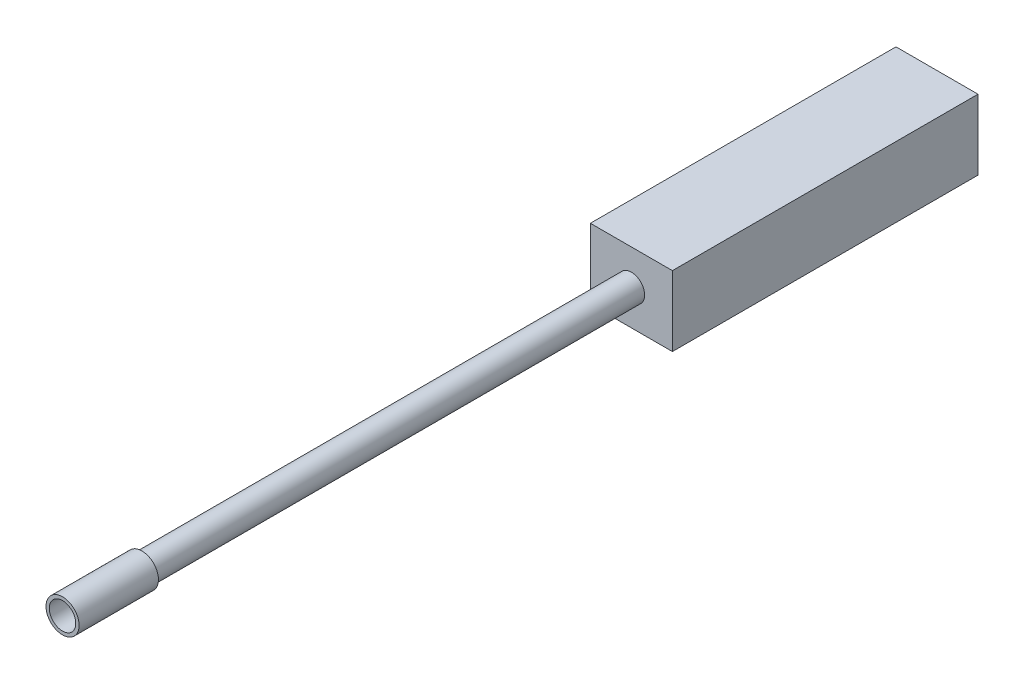
ISO-10303-21;
HEADER;
FILE_DESCRIPTION(('STEP AP214'),'2;1');
FILE_NAME('part.step','',(''),(''),'','','');
FILE_SCHEMA(('AUTOMOTIVE_DESIGN { 1 0 10303 214 1 1 1 1 }'));
ENDSEC;
DATA;
#1=APPLICATION_CONTEXT('core data for automotive mechanical design processes');
#2=APPLICATION_PROTOCOL_DEFINITION('international standard','automotive_design',2000,#1);
#3=PRODUCT_CONTEXT('',#1,'mechanical');
#4=PRODUCT('Part','Part','',(#3));
#5=PRODUCT_RELATED_PRODUCT_CATEGORY('part','',(#4));
#6=PRODUCT_DEFINITION_FORMATION('','',#4);
#7=PRODUCT_DEFINITION_CONTEXT('part definition',#1,'design');
#8=PRODUCT_DEFINITION('design','',#6,#7);
#9=PRODUCT_DEFINITION_SHAPE('','',#8);
#10=(LENGTH_UNIT() NAMED_UNIT(*) SI_UNIT(.MILLI.,.METRE.));
#11=(NAMED_UNIT(*) PLANE_ANGLE_UNIT() SI_UNIT($,.RADIAN.));
#12=(NAMED_UNIT(*) SI_UNIT($,.STERADIAN.) SOLID_ANGLE_UNIT());
#13=UNCERTAINTY_MEASURE_WITH_UNIT(LENGTH_MEASURE(1.E-05),#10,'distance_accuracy_value','');
#14=(GEOMETRIC_REPRESENTATION_CONTEXT(3) GLOBAL_UNCERTAINTY_ASSIGNED_CONTEXT((#13)) GLOBAL_UNIT_ASSIGNED_CONTEXT((#10,
#11,#12)) REPRESENTATION_CONTEXT('',''));
#15=CARTESIAN_POINT('',(0.,0.,0.));
#16=DIRECTION('',(0.,0.,1.));
#17=DIRECTION('',(1.,0.,0.));
#18=AXIS2_PLACEMENT_3D('',#15,#16,#17);
#19=CARTESIAN_POINT('',(78.74,67.31,1602.74));
#20=DIRECTION('',(0.,0.,-1.));
#21=DIRECTION('',(-1.,0.,0.));
#22=AXIS2_PLACEMENT_3D('',#19,#20,#21);
#23=CYLINDRICAL_SURFACE('',#22,25.4);
#24=CARTESIAN_POINT('',(78.74,67.31,586.74));
#25=DIRECTION('',(0.,0.,1.));
#26=DIRECTION('',(1.,0.,0.));
#27=AXIS2_PLACEMENT_3D('',#24,#25,#26);
#28=CIRCLE('',#27,25.4);
#29=CARTESIAN_POINT('',(104.14,67.31,586.74));
#30=VERTEX_POINT('',#29);
#31=EDGE_CURVE('E45',#30,#30,#28,.T.);
#32=ORIENTED_EDGE('',*,*,#31,.T.);
#33=EDGE_LOOP('',(#32));
#34=FACE_BOUND('',#33,.T.);
#35=CARTESIAN_POINT('',(78.74,67.31,1526.54));
#36=DIRECTION('',(0.,0.,1.));
#37=DIRECTION('',(1.,0.,0.));
#38=AXIS2_PLACEMENT_3D('',#35,#36,#37);
#39=CIRCLE('',#38,25.4);
#40=CARTESIAN_POINT('',(104.14,67.31,1526.54));
#41=VERTEX_POINT('',#40);
#42=EDGE_CURVE('E11',#41,#41,#39,.T.);
#43=ORIENTED_EDGE('',*,*,#42,.F.);
#44=EDGE_LOOP('',(#43));
#45=FACE_BOUND('',#44,.T.);
#46=ADVANCED_FACE('F36',(#34,#45),#23,.T.);
#47=CARTESIAN_POINT('',(0.,0.,586.74));
#48=DIRECTION('',(1.,0.,0.));
#49=DIRECTION('',(0.,0.,-1.));
#50=AXIS2_PLACEMENT_3D('',#47,#48,#49);
#51=PLANE('',#50);
#52=DIRECTION('',(0.,-1.,0.));
#53=VECTOR('',#52,1.);
#54=CARTESIAN_POINT('',(0.,0.,0.));
#55=LINE('',#54,#53);
#56=CARTESIAN_POINT('',(0.,134.62,0.));
#57=VERTEX_POINT('',#56);
#58=CARTESIAN_POINT('',(0.,0.,0.));
#59=VERTEX_POINT('',#58);
#60=EDGE_CURVE('E104',#57,#59,#55,.T.);
#61=ORIENTED_EDGE('',*,*,#60,.T.);
#62=DIRECTION('',(0.,0.,-1.));
#63=VECTOR('',#62,1.);
#64=CARTESIAN_POINT('',(0.,0.,586.74));
#65=LINE('',#64,#63);
#66=CARTESIAN_POINT('',(0.,0.,586.74));
#67=VERTEX_POINT('',#66);
#68=EDGE_CURVE('E95',#67,#59,#65,.T.);
#69=ORIENTED_EDGE('',*,*,#68,.F.);
#70=DIRECTION('',(0.,-1.,0.));
#71=VECTOR('',#70,1.);
#72=CARTESIAN_POINT('',(0.,0.,586.74));
#73=LINE('',#72,#71);
#74=CARTESIAN_POINT('',(0.,134.62,586.74));
#75=VERTEX_POINT('',#74);
#76=EDGE_CURVE('E89',#75,#67,#73,.T.);
#77=ORIENTED_EDGE('',*,*,#76,.F.);
#78=DIRECTION('',(0.,0.,-1.));
#79=VECTOR('',#78,1.);
#80=CARTESIAN_POINT('',(0.,134.62,586.74));
#81=LINE('',#80,#79);
#82=EDGE_CURVE('E100',#75,#57,#81,.T.);
#83=ORIENTED_EDGE('',*,*,#82,.T.);
#84=EDGE_LOOP('',(#61,#69,#77,#83));
#85=FACE_BOUND('',#84,.T.);
#86=ADVANCED_FACE('F38',(#85),#51,.F.);
#87=CARTESIAN_POINT('',(0.,0.,586.74));
#88=DIRECTION('',(0.,1.,0.));
#89=DIRECTION('',(0.,0.,1.));
#90=AXIS2_PLACEMENT_3D('',#87,#88,#89);
#91=PLANE('',#90);
#92=DIRECTION('',(1.,0.,0.));
#93=VECTOR('',#92,1.);
#94=CARTESIAN_POINT('',(0.,0.,0.));
#95=LINE('',#94,#93);
#96=CARTESIAN_POINT('',(157.48,0.,0.));
#97=VERTEX_POINT('',#96);
#98=EDGE_CURVE('E94',#59,#97,#95,.T.);
#99=ORIENTED_EDGE('',*,*,#98,.T.);
#100=DIRECTION('',(0.,0.,-1.));
#101=VECTOR('',#100,1.);
#102=CARTESIAN_POINT('',(157.48,0.,586.74));
#103=LINE('',#102,#101);
#104=CARTESIAN_POINT('',(157.48,0.,586.74));
#105=VERTEX_POINT('',#104);
#106=EDGE_CURVE('E92',#105,#97,#103,.T.);
#107=ORIENTED_EDGE('',*,*,#106,.F.);
#108=DIRECTION('',(1.,0.,0.));
#109=VECTOR('',#108,1.);
#110=CARTESIAN_POINT('',(0.,0.,586.74));
#111=LINE('',#110,#109);
#112=EDGE_CURVE('E84',#67,#105,#111,.T.);
#113=ORIENTED_EDGE('',*,*,#112,.F.);
#114=ORIENTED_EDGE('',*,*,#68,.T.);
#115=EDGE_LOOP('',(#99,#107,#113,#114));
#116=FACE_BOUND('',#115,.T.);
#117=ADVANCED_FACE('F93',(#116),#91,.F.);
#118=CARTESIAN_POINT('',(157.48,0.,586.74));
#119=DIRECTION('',(-1.,0.,0.));
#120=DIRECTION('',(0.,0.,1.));
#121=AXIS2_PLACEMENT_3D('',#118,#119,#120);
#122=PLANE('',#121);
#123=DIRECTION('',(0.,1.,0.));
#124=VECTOR('',#123,1.);
#125=CARTESIAN_POINT('',(157.48,0.,0.));
#126=LINE('',#125,#124);
#127=CARTESIAN_POINT('',(157.48,134.62,0.));
#128=VERTEX_POINT('',#127);
#129=EDGE_CURVE('E70',#97,#128,#126,.T.);
#130=ORIENTED_EDGE('',*,*,#129,.T.);
#131=DIRECTION('',(0.,0.,-1.));
#132=VECTOR('',#131,1.);
#133=CARTESIAN_POINT('',(157.48,134.62,586.74));
#134=LINE('',#133,#132);
#135=CARTESIAN_POINT('',(157.48,134.62,586.74));
#136=VERTEX_POINT('',#135);
#137=EDGE_CURVE('E96',#136,#128,#134,.T.);
#138=ORIENTED_EDGE('',*,*,#137,.F.);
#139=DIRECTION('',(0.,1.,0.));
#140=VECTOR('',#139,1.);
#141=CARTESIAN_POINT('',(157.48,0.,586.74));
#142=LINE('',#141,#140);
#143=EDGE_CURVE('E87',#105,#136,#142,.T.);
#144=ORIENTED_EDGE('',*,*,#143,.F.);
#145=ORIENTED_EDGE('',*,*,#106,.T.);
#146=EDGE_LOOP('',(#130,#138,#144,#145));
#147=FACE_BOUND('',#146,.T.);
#148=ADVANCED_FACE('F98',(#147),#122,.F.);
#149=CARTESIAN_POINT('',(0.,134.62,586.74));
#150=DIRECTION('',(0.,-1.,0.));
#151=DIRECTION('',(0.,0.,-1.));
#152=AXIS2_PLACEMENT_3D('',#149,#150,#151);
#153=PLANE('',#152);
#154=DIRECTION('',(-1.,0.,0.));
#155=VECTOR('',#154,1.);
#156=CARTESIAN_POINT('',(0.,134.62,0.));
#157=LINE('',#156,#155);
#158=EDGE_CURVE('E76',#128,#57,#157,.T.);
#159=ORIENTED_EDGE('',*,*,#158,.T.);
#160=ORIENTED_EDGE('',*,*,#82,.F.);
#161=DIRECTION('',(-1.,0.,0.));
#162=VECTOR('',#161,1.);
#163=CARTESIAN_POINT('',(0.,134.62,586.74));
#164=LINE('',#163,#162);
#165=EDGE_CURVE('E53',#136,#75,#164,.T.);
#166=ORIENTED_EDGE('',*,*,#165,.F.);
#167=ORIENTED_EDGE('',*,*,#137,.T.);
#168=EDGE_LOOP('',(#159,#160,#166,#167));
#169=FACE_BOUND('',#168,.T.);
#170=ADVANCED_FACE('F165',(#169),#153,.F.);
#171=CARTESIAN_POINT('',(0.,0.,586.74));
#172=DIRECTION('',(0.,0.,-1.));
#173=DIRECTION('',(-1.,0.,0.));
#174=AXIS2_PLACEMENT_3D('',#171,#172,#173);
#175=PLANE('',#174);
#176=ORIENTED_EDGE('',*,*,#31,.F.);
#177=EDGE_LOOP('',(#176));
#178=FACE_BOUND('',#177,.T.);
#179=ORIENTED_EDGE('',*,*,#76,.T.);
#180=ORIENTED_EDGE('',*,*,#112,.T.);
#181=ORIENTED_EDGE('',*,*,#143,.T.);
#182=ORIENTED_EDGE('',*,*,#165,.T.);
#183=EDGE_LOOP('',(#179,#180,#181,#182));
#184=FACE_BOUND('',#183,.T.);
#185=ADVANCED_FACE('F85',(#178,#184),#175,.F.);
#186=CARTESIAN_POINT('',(0.,0.,0.));
#187=DIRECTION('',(0.,0.,-1.));
#188=DIRECTION('',(-1.,0.,0.));
#189=AXIS2_PLACEMENT_3D('',#186,#187,#188);
#190=PLANE('',#189);
#191=ORIENTED_EDGE('',*,*,#60,.F.);
#192=ORIENTED_EDGE('',*,*,#158,.F.);
#193=ORIENTED_EDGE('',*,*,#129,.F.);
#194=ORIENTED_EDGE('',*,*,#98,.F.);
#195=EDGE_LOOP('',(#191,#192,#193,#194));
#196=FACE_BOUND('',#195,.T.);
#197=ADVANCED_FACE('F140',(#196),#190,.T.);
#198=CARTESIAN_POINT('',(78.74,67.31,1678.94));
#199=DIRECTION('',(0.,0.,1.));
#200=DIRECTION('',(1.,0.,0.));
#201=AXIS2_PLACEMENT_3D('',#198,#199,#200);
#202=PLANE('',#201);
#203=CARTESIAN_POINT('',(78.74,67.31,1678.94));
#204=DIRECTION('',(0.,0.,1.));
#205=DIRECTION('',(1.,0.,0.));
#206=AXIS2_PLACEMENT_3D('',#203,#204,#205);
#207=CIRCLE('',#206,31.75);
#208=CARTESIAN_POINT('',(46.99,67.31,1678.94));
#209=VERTEX_POINT('',#208);
#210=EDGE_CURVE('E125',#209,#209,#207,.T.);
#211=ORIENTED_EDGE('',*,*,#210,.T.);
#212=EDGE_LOOP('',(#211));
#213=FACE_BOUND('',#212,.T.);
#214=CARTESIAN_POINT('',(78.74,67.31,1678.94));
#215=DIRECTION('',(0.,0.,1.));
#216=DIRECTION('',(1.,0.,0.));
#217=AXIS2_PLACEMENT_3D('',#214,#215,#216);
#218=CIRCLE('',#217,25.4);
#219=CARTESIAN_POINT('',(53.34,67.31,1678.94));
#220=VERTEX_POINT('',#219);
#221=EDGE_CURVE('E129',#220,#220,#218,.T.);
#222=ORIENTED_EDGE('',*,*,#221,.F.);
#223=EDGE_LOOP('',(#222));
#224=FACE_BOUND('',#223,.T.);
#225=ADVANCED_FACE('F137',(#213,#224),#202,.T.);
#226=CARTESIAN_POINT('',(78.74,67.31,1526.54));
#227=DIRECTION('',(0.,0.,1.));
#228=DIRECTION('',(1.,0.,0.));
#229=AXIS2_PLACEMENT_3D('',#226,#227,#228);
#230=PLANE('',#229);
#231=CARTESIAN_POINT('',(78.74,67.31,1526.54));
#232=DIRECTION('',(0.,0.,1.));
#233=DIRECTION('',(1.,0.,0.));
#234=AXIS2_PLACEMENT_3D('',#231,#232,#233);
#235=CIRCLE('',#234,31.75);
#236=CARTESIAN_POINT('',(46.99,67.31,1526.54));
#237=VERTEX_POINT('',#236);
#238=EDGE_CURVE('E126',#237,#237,#235,.T.);
#239=ORIENTED_EDGE('',*,*,#238,.F.);
#240=EDGE_LOOP('',(#239));
#241=FACE_BOUND('',#240,.T.);
#242=ORIENTED_EDGE('',*,*,#42,.T.);
#243=EDGE_LOOP('',(#242));
#244=FACE_BOUND('',#243,.T.);
#245=ADVANCED_FACE('F139',(#241,#244),#230,.F.);
#246=CARTESIAN_POINT('',(78.74,67.31,1678.94));
#247=DIRECTION('',(0.,0.,-1.));
#248=DIRECTION('',(-1.,0.,0.));
#249=AXIS2_PLACEMENT_3D('',#246,#247,#248);
#250=CYLINDRICAL_SURFACE('',#249,31.75);
#251=CARTESIAN_POINT('',(46.99,67.31,1678.94));
#252=CARTESIAN_POINT('',(46.99,67.31,1677.3525));
#253=CARTESIAN_POINT('',(46.99,67.31,1675.765));
#254=CARTESIAN_POINT('',(46.99,67.31,1672.59));
#255=CARTESIAN_POINT('',(46.99,67.31,1671.0025));
#256=CARTESIAN_POINT('',(46.99,67.31,1667.8275));
#257=CARTESIAN_POINT('',(46.99,67.31,1666.24));
#258=CARTESIAN_POINT('',(46.99,67.31,1663.065));
#259=CARTESIAN_POINT('',(46.99,67.31,1661.4775));
#260=CARTESIAN_POINT('',(46.99,67.31,1658.3025));
#261=CARTESIAN_POINT('',(46.99,67.31,1656.715));
#262=CARTESIAN_POINT('',(46.99,67.31,1653.54));
#263=CARTESIAN_POINT('',(46.99,67.31,1651.9525));
#264=CARTESIAN_POINT('',(46.99,67.31,1648.7775));
#265=CARTESIAN_POINT('',(46.99,67.31,1647.19));
#266=CARTESIAN_POINT('',(46.99,67.31,1644.015));
#267=CARTESIAN_POINT('',(46.99,67.31,1642.4275));
#268=CARTESIAN_POINT('',(46.99,67.31,1639.2525));
#269=CARTESIAN_POINT('',(46.99,67.31,1637.665));
#270=CARTESIAN_POINT('',(46.99,67.31,1634.49));
#271=CARTESIAN_POINT('',(46.99,67.31,1632.9025));
#272=CARTESIAN_POINT('',(46.99,67.31,1629.7275));
#273=CARTESIAN_POINT('',(46.99,67.31,1628.14));
#274=CARTESIAN_POINT('',(46.99,67.31,1624.965));
#275=CARTESIAN_POINT('',(46.99,67.31,1623.3775));
#276=CARTESIAN_POINT('',(46.99,67.31,1620.2025));
#277=CARTESIAN_POINT('',(46.99,67.31,1618.615));
#278=CARTESIAN_POINT('',(46.99,67.31,1615.44));
#279=CARTESIAN_POINT('',(46.99,67.31,1613.8525));
#280=CARTESIAN_POINT('',(46.99,67.31,1610.6775));
#281=CARTESIAN_POINT('',(46.99,67.31,1609.09));
#282=CARTESIAN_POINT('',(46.99,67.31,1605.915));
#283=CARTESIAN_POINT('',(46.99,67.31,1604.3275));
#284=CARTESIAN_POINT('',(46.99,67.31,1601.1525));
#285=CARTESIAN_POINT('',(46.99,67.31,1599.565));
#286=CARTESIAN_POINT('',(46.99,67.31,1596.39));
#287=CARTESIAN_POINT('',(46.99,67.31,1594.8025));
#288=CARTESIAN_POINT('',(46.99,67.31,1591.6275));
#289=CARTESIAN_POINT('',(46.99,67.31,1590.04));
#290=CARTESIAN_POINT('',(46.99,67.31,1586.865));
#291=CARTESIAN_POINT('',(46.99,67.31,1585.2775));
#292=CARTESIAN_POINT('',(46.99,67.31,1582.1025));
#293=CARTESIAN_POINT('',(46.99,67.31,1580.515));
#294=CARTESIAN_POINT('',(46.99,67.31,1577.34));
#295=CARTESIAN_POINT('',(46.99,67.31,1575.7525));
#296=CARTESIAN_POINT('',(46.99,67.31,1572.5775));
#297=CARTESIAN_POINT('',(46.99,67.31,1570.99));
#298=CARTESIAN_POINT('',(46.99,67.31,1567.815));
#299=CARTESIAN_POINT('',(46.99,67.31,1566.2275));
#300=CARTESIAN_POINT('',(46.99,67.31,1563.0525));
#301=CARTESIAN_POINT('',(46.99,67.31,1561.465));
#302=CARTESIAN_POINT('',(46.99,67.31,1558.29));
#303=CARTESIAN_POINT('',(46.99,67.31,1556.7025));
#304=CARTESIAN_POINT('',(46.99,67.31,1553.5275));
#305=CARTESIAN_POINT('',(46.99,67.31,1551.94));
#306=CARTESIAN_POINT('',(46.99,67.31,1548.765));
#307=CARTESIAN_POINT('',(46.99,67.31,1547.1775));
#308=CARTESIAN_POINT('',(46.99,67.31,1544.0025));
#309=CARTESIAN_POINT('',(46.99,67.31,1542.415));
#310=CARTESIAN_POINT('',(46.99,67.31,1539.24));
#311=CARTESIAN_POINT('',(46.99,67.31,1537.6525));
#312=CARTESIAN_POINT('',(46.99,67.31,1534.4775));
#313=CARTESIAN_POINT('',(46.99,67.31,1532.89));
#314=CARTESIAN_POINT('',(46.99,67.31,1529.715));
#315=CARTESIAN_POINT('',(46.99,67.31,1528.1275));
#316=CARTESIAN_POINT('',(46.99,67.31,1526.54));
#317=B_SPLINE_CURVE_WITH_KNOTS('',3,(#251,#252,#253,#254,#255,#256,#257,#258,#259,#260,#261,
#262,#263,#264,#265,#266,#267,#268,#269,#270,#271,#272,#273,#274,#275,#276,#277,#278,#279,#280,
#281,#282,#283,#284,#285,#286,#287,#288,#289,#290,#291,#292,#293,#294,#295,#296,#297,#298,#299,
#300,#301,#302,#303,#304,#305,#306,#307,#308,#309,#310,#311,#312,#313,#314,#315,#316),
.UNSPECIFIED.,.F.,.F.,(4,2,2,2,2,2,2,2,2,2,2,2,2,2,2,2,2,2,2,2,2,2,2,2,2,2,2,2,2,2,2,2,4),(0.,
4.7625,9.52500000000001,14.2875,19.05,23.8125,28.575,33.3375,38.1,42.8625,47.625,52.3875,57.15,
61.9125,66.675,71.4375,76.2,80.9625,85.7250000000001,90.4875000000001,95.2500000000001,100.0125,
104.775,109.5375,114.3,119.0625,123.825,128.5875,133.35,138.1125,142.875,147.6375,152.4),.UNSPECIFIED.);
#318=EDGE_CURVE('BSEAM147',#209,#237,#317,.T.);
#319=ORIENTED_EDGE('',*,*,#210,.F.);
#320=ORIENTED_EDGE('',*,*,#238,.T.);
#321=ORIENTED_EDGE('',*,*,#318,.T.);
#322=ORIENTED_EDGE('',*,*,#318,.F.);
#323=EDGE_LOOP('',(#319,#321,#320,#322));
#324=FACE_BOUND('',#323,.T.);
#325=ADVANCED_FACE('F147',(#324),#250,.T.);
#326=CARTESIAN_POINT('',(78.74,67.31,1678.94));
#327=DIRECTION('',(0.,0.,-1.));
#328=DIRECTION('',(-1.,0.,0.));
#329=AXIS2_PLACEMENT_3D('',#326,#327,#328);
#330=CYLINDRICAL_SURFACE('',#329,25.4);
#331=CARTESIAN_POINT('',(78.74,67.31,1602.74));
#332=DIRECTION('',(0.,0.,1.));
#333=DIRECTION('',(1.,0.,0.));
#334=AXIS2_PLACEMENT_3D('',#331,#332,#333);
#335=CIRCLE('',#334,25.4);
#336=CARTESIAN_POINT('',(53.34,67.31,1602.74));
#337=VERTEX_POINT('',#336);
#338=EDGE_CURVE('E120',#337,#337,#335,.F.);
#339=CARTESIAN_POINT('',(53.34,67.31,1602.74));
#340=CARTESIAN_POINT('',(53.34,67.31,1603.53375));
#341=CARTESIAN_POINT('',(53.34,67.31,1604.3275));
#342=CARTESIAN_POINT('',(53.34,67.31,1605.915));
#343=CARTESIAN_POINT('',(53.34,67.31,1606.70875));
#344=CARTESIAN_POINT('',(53.34,67.31,1608.29625));
#345=CARTESIAN_POINT('',(53.34,67.31,1609.09));
#346=CARTESIAN_POINT('',(53.34,67.31,1610.6775));
#347=CARTESIAN_POINT('',(53.34,67.31,1611.47125));
#348=CARTESIAN_POINT('',(53.34,67.31,1613.05875));
#349=CARTESIAN_POINT('',(53.34,67.31,1613.8525));
#350=CARTESIAN_POINT('',(53.34,67.31,1615.44));
#351=CARTESIAN_POINT('',(53.34,67.31,1616.23375));
#352=CARTESIAN_POINT('',(53.34,67.31,1617.82125));
#353=CARTESIAN_POINT('',(53.34,67.31,1618.615));
#354=CARTESIAN_POINT('',(53.34,67.31,1620.2025));
#355=CARTESIAN_POINT('',(53.34,67.31,1620.99625));
#356=CARTESIAN_POINT('',(53.34,67.31,1622.58375));
#357=CARTESIAN_POINT('',(53.34,67.31,1623.3775));
#358=CARTESIAN_POINT('',(53.34,67.31,1624.965));
#359=CARTESIAN_POINT('',(53.34,67.31,1625.75875));
#360=CARTESIAN_POINT('',(53.34,67.31,1627.34625));
#361=CARTESIAN_POINT('',(53.34,67.31,1628.14));
#362=CARTESIAN_POINT('',(53.34,67.31,1629.7275));
#363=CARTESIAN_POINT('',(53.34,67.31,1630.52125));
#364=CARTESIAN_POINT('',(53.34,67.31,1632.10875));
#365=CARTESIAN_POINT('',(53.34,67.31,1632.9025));
#366=CARTESIAN_POINT('',(53.34,67.31,1634.49));
#367=CARTESIAN_POINT('',(53.34,67.31,1635.28375));
#368=CARTESIAN_POINT('',(53.34,67.31,1636.87125));
#369=CARTESIAN_POINT('',(53.34,67.31,1637.665));
#370=CARTESIAN_POINT('',(53.34,67.31,1639.2525));
#371=CARTESIAN_POINT('',(53.34,67.31,1640.04625));
#372=CARTESIAN_POINT('',(53.34,67.31,1641.63375));
#373=CARTESIAN_POINT('',(53.34,67.31,1642.4275));
#374=CARTESIAN_POINT('',(53.34,67.31,1644.015));
#375=CARTESIAN_POINT('',(53.34,67.31,1644.80875));
#376=CARTESIAN_POINT('',(53.34,67.31,1646.39625));
#377=CARTESIAN_POINT('',(53.34,67.31,1647.19));
#378=CARTESIAN_POINT('',(53.34,67.31,1648.7775));
#379=CARTESIAN_POINT('',(53.34,67.31,1649.57125));
#380=CARTESIAN_POINT('',(53.34,67.31,1651.15875));
#381=CARTESIAN_POINT('',(53.34,67.31,1651.9525));
#382=CARTESIAN_POINT('',(53.34,67.31,1653.54));
#383=CARTESIAN_POINT('',(53.34,67.31,1654.33375));
#384=CARTESIAN_POINT('',(53.34,67.31,1655.92125));
#385=CARTESIAN_POINT('',(53.34,67.31,1656.715));
#386=CARTESIAN_POINT('',(53.34,67.31,1658.3025));
#387=CARTESIAN_POINT('',(53.34,67.31,1659.09625));
#388=CARTESIAN_POINT('',(53.34,67.31,1660.68375));
#389=CARTESIAN_POINT('',(53.34,67.31,1661.4775));
#390=CARTESIAN_POINT('',(53.34,67.31,1663.065));
#391=CARTESIAN_POINT('',(53.34,67.31,1663.85875));
#392=CARTESIAN_POINT('',(53.34,67.31,1665.44625));
#393=CARTESIAN_POINT('',(53.34,67.31,1666.24));
#394=CARTESIAN_POINT('',(53.34,67.31,1667.8275));
#395=CARTESIAN_POINT('',(53.34,67.31,1668.62125));
#396=CARTESIAN_POINT('',(53.34,67.31,1670.20875));
#397=CARTESIAN_POINT('',(53.34,67.31,1671.0025));
#398=CARTESIAN_POINT('',(53.34,67.31,1672.59));
#399=CARTESIAN_POINT('',(53.34,67.31,1673.38375));
#400=CARTESIAN_POINT('',(53.34,67.31,1674.97125));
#401=CARTESIAN_POINT('',(53.34,67.31,1675.765));
#402=CARTESIAN_POINT('',(53.34,67.31,1677.3525));
#403=CARTESIAN_POINT('',(53.34,67.31,1678.14625));
#404=CARTESIAN_POINT('',(53.34,67.31,1678.94));
#405=B_SPLINE_CURVE_WITH_KNOTS('',3,(#339,#340,#341,#342,#343,#344,#345,#346,#347,#348,#349,
#350,#351,#352,#353,#354,#355,#356,#357,#358,#359,#360,#361,#362,#363,#364,#365,#366,#367,#368,
#369,#370,#371,#372,#373,#374,#375,#376,#377,#378,#379,#380,#381,#382,#383,#384,#385,#386,#387,
#388,#389,#390,#391,#392,#393,#394,#395,#396,#397,#398,#399,#400,#401,#402,#403,#404),
.UNSPECIFIED.,.F.,.F.,(4,2,2,2,2,2,2,2,2,2,2,2,2,2,2,2,2,2,2,2,2,2,2,2,2,2,2,2,2,2,2,2,4),(0.,
2.38125,4.7625,7.14375,9.52500000000001,11.90625,14.2875,16.66875,19.05,21.43125,23.8125,
26.19375,28.575,30.95625,33.3375,35.71875,38.1,40.48125,42.8625,45.24375,47.625,50.00625,
52.3875,54.76875,57.15,59.53125,61.9125,64.29375,66.675,69.05625,71.4375,73.8187500000001,76.2),.UNSPECIFIED.);
#406=EDGE_CURVE('BSEAM135',#337,#220,#405,.T.);
#407=ORIENTED_EDGE('',*,*,#338,.T.);
#408=ORIENTED_EDGE('',*,*,#221,.T.);
#409=ORIENTED_EDGE('',*,*,#406,.T.);
#410=ORIENTED_EDGE('',*,*,#406,.F.);
#411=EDGE_LOOP('',(#407,#409,#408,#410));
#412=FACE_BOUND('',#411,.T.);
#413=ADVANCED_FACE('F135',(#412),#330,.F.);
#414=CARTESIAN_POINT('',(78.74,67.31,586.74));
#415=DIRECTION('',(0.,0.,1.));
#416=DIRECTION('',(1.,0.,0.));
#417=AXIS2_PLACEMENT_3D('',#414,#415,#416);
#418=CIRCLE('',#417,6.34999999999999);
#419=CARTESIAN_POINT('',(85.09,67.31,586.74));
#420=VERTEX_POINT('',#419);
#421=EDGE_CURVE('E117',#420,#420,#418,.T.);
#422=ORIENTED_EDGE('',*,*,#421,.T.);
#423=EDGE_LOOP('',(#422));
#424=FACE_BOUND('',#423,.T.);
#425=ADVANCED_FACE('F167',(#424),#175,.F.);
#426=CARTESIAN_POINT('',(78.74,67.31,1602.74));
#427=DIRECTION('',(0.,0.,-1.));
#428=DIRECTION('',(-1.,0.,0.));
#429=AXIS2_PLACEMENT_3D('',#426,#427,#428);
#430=CYLINDRICAL_SURFACE('',#429,6.34999999999999);
#431=CARTESIAN_POINT('',(78.74,67.31,1602.74));
#432=DIRECTION('',(0.,0.,1.));
#433=DIRECTION('',(1.,0.,0.));
#434=AXIS2_PLACEMENT_3D('',#431,#432,#433);
#435=CIRCLE('',#434,6.34999999999999);
#436=CARTESIAN_POINT('',(85.09,67.31,1602.74));
#437=VERTEX_POINT('',#436);
#438=EDGE_CURVE('E107',#437,#437,#435,.T.);
#439=ORIENTED_EDGE('',*,*,#438,.T.);
#440=EDGE_LOOP('',(#439));
#441=FACE_BOUND('',#440,.T.);
#442=ORIENTED_EDGE('',*,*,#421,.F.);
#443=EDGE_LOOP('',(#442));
#444=FACE_BOUND('',#443,.T.);
#445=ADVANCED_FACE('F206',(#441,#444),#430,.F.);
#446=CARTESIAN_POINT('',(78.74,67.31,1602.74));
#447=DIRECTION('',(0.,0.,1.));
#448=DIRECTION('',(1.,0.,0.));
#449=AXIS2_PLACEMENT_3D('',#446,#447,#448);
#450=PLANE('',#449);
#451=ORIENTED_EDGE('',*,*,#338,.F.);
#452=EDGE_LOOP('',(#451));
#453=FACE_BOUND('',#452,.T.);
#454=ORIENTED_EDGE('',*,*,#438,.F.);
#455=EDGE_LOOP('',(#454));
#456=FACE_BOUND('',#455,.T.);
#457=ADVANCED_FACE('F162',(#453,#456),#450,.T.);
#458=CLOSED_SHELL('',(#46,#86,#117,#148,#170,#185,#197,#225,#245,#325,#413,#425,#445,#457));
#459=MANIFOLD_SOLID_BREP('B2',#458);
#460=ADVANCED_BREP_SHAPE_REPRESENTATION('',(#18,#459),#14);
#461=SHAPE_DEFINITION_REPRESENTATION(#9,#460);
ENDSEC;
END-ISO-10303-21;
